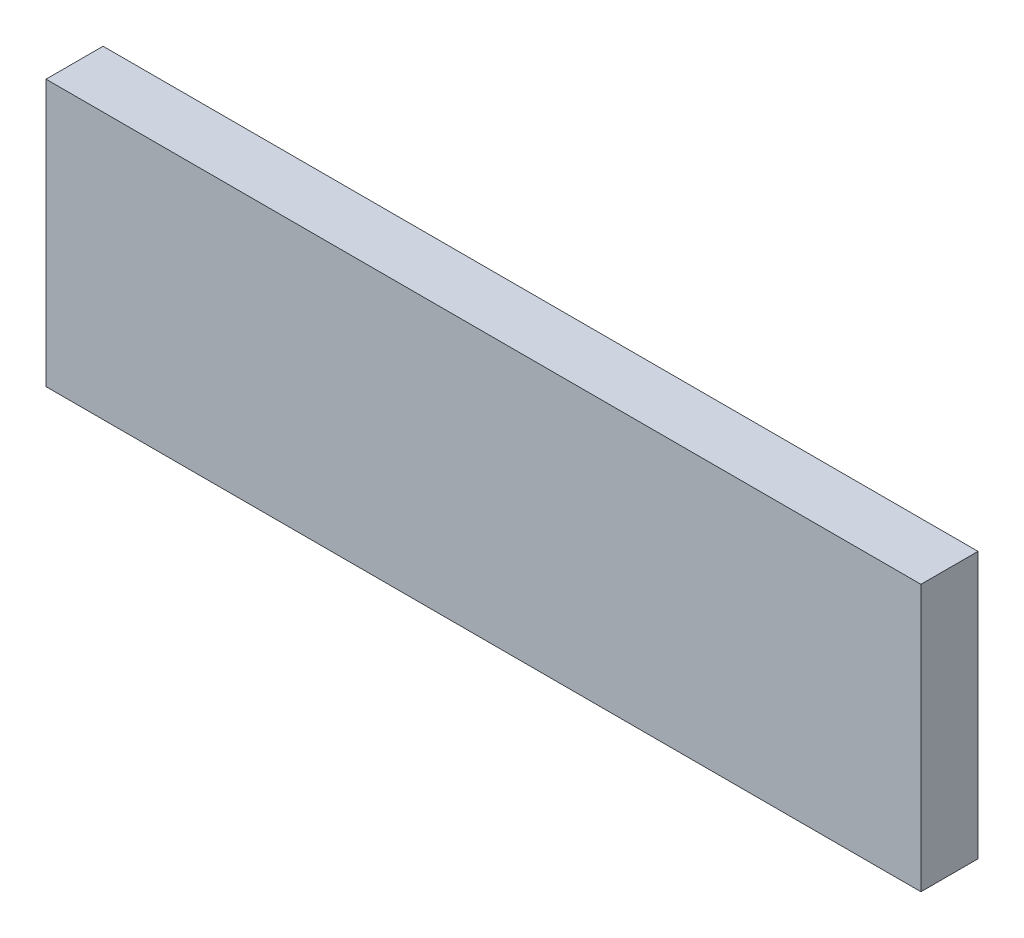
ISO-10303-21;
HEADER;
FILE_DESCRIPTION(('STEP AP214'),'2;1');
FILE_NAME('part.step','',(''),(''),'','','');
FILE_SCHEMA(('AUTOMOTIVE_DESIGN { 1 0 10303 214 1 1 1 1 }'));
ENDSEC;
DATA;
#1=APPLICATION_CONTEXT('core data for automotive mechanical design processes');
#2=APPLICATION_PROTOCOL_DEFINITION('international standard','automotive_design',2000,#1);
#3=PRODUCT_CONTEXT('',#1,'mechanical');
#4=PRODUCT('Part','Part','',(#3));
#5=PRODUCT_RELATED_PRODUCT_CATEGORY('part','',(#4));
#6=PRODUCT_DEFINITION_FORMATION('','',#4);
#7=PRODUCT_DEFINITION_CONTEXT('part definition',#1,'design');
#8=PRODUCT_DEFINITION('design','',#6,#7);
#9=PRODUCT_DEFINITION_SHAPE('','',#8);
#10=(LENGTH_UNIT() NAMED_UNIT(*) SI_UNIT(.MILLI.,.METRE.));
#11=(NAMED_UNIT(*) PLANE_ANGLE_UNIT() SI_UNIT($,.RADIAN.));
#12=(NAMED_UNIT(*) SI_UNIT($,.STERADIAN.) SOLID_ANGLE_UNIT());
#13=UNCERTAINTY_MEASURE_WITH_UNIT(LENGTH_MEASURE(1.E-05),#10,'distance_accuracy_value','');
#14=(GEOMETRIC_REPRESENTATION_CONTEXT(3) GLOBAL_UNCERTAINTY_ASSIGNED_CONTEXT((#13)) GLOBAL_UNIT_ASSIGNED_CONTEXT((#10,
#11,#12)) REPRESENTATION_CONTEXT('',''));
#15=CARTESIAN_POINT('',(0.,0.,0.));
#16=DIRECTION('',(0.,0.,1.));
#17=DIRECTION('',(1.,0.,0.));
#18=AXIS2_PLACEMENT_3D('',#15,#16,#17);
#19=CARTESIAN_POINT('',(0.,0.,3.));
#20=DIRECTION('',(1.,0.,0.));
#21=DIRECTION('',(0.,0.,-1.));
#22=AXIS2_PLACEMENT_3D('',#19,#20,#21);
#23=PLANE('',#22);
#24=DIRECTION('',(0.,-1.,0.));
#25=VECTOR('',#24,1.);
#26=CARTESIAN_POINT('',(0.,0.,0.));
#27=LINE('',#26,#25);
#28=CARTESIAN_POINT('',(0.,14.,0.));
#29=VERTEX_POINT('',#28);
#30=CARTESIAN_POINT('',(0.,0.,0.));
#31=VERTEX_POINT('',#30);
#32=EDGE_CURVE('E96',#29,#31,#27,.T.);
#33=ORIENTED_EDGE('',*,*,#32,.T.);
#34=DIRECTION('',(0.,0.,-1.));
#35=VECTOR('',#34,1.);
#36=CARTESIAN_POINT('',(0.,0.,3.));
#37=LINE('',#36,#35);
#38=CARTESIAN_POINT('',(0.,0.,3.));
#39=VERTEX_POINT('',#38);
#40=EDGE_CURVE('E11',#39,#31,#37,.T.);
#41=ORIENTED_EDGE('',*,*,#40,.F.);
#42=DIRECTION('',(0.,-1.,0.));
#43=VECTOR('',#42,1.);
#44=CARTESIAN_POINT('',(0.,0.,3.));
#45=LINE('',#44,#43);
#46=CARTESIAN_POINT('',(0.,14.,3.));
#47=VERTEX_POINT('',#46);
#48=EDGE_CURVE('E84',#47,#39,#45,.T.);
#49=ORIENTED_EDGE('',*,*,#48,.F.);
#50=DIRECTION('',(0.,0.,-1.));
#51=VECTOR('',#50,1.);
#52=CARTESIAN_POINT('',(0.,14.,3.));
#53=LINE('',#52,#51);
#54=EDGE_CURVE('E92',#47,#29,#53,.T.);
#55=ORIENTED_EDGE('',*,*,#54,.T.);
#56=EDGE_LOOP('',(#33,#41,#49,#55));
#57=FACE_BOUND('',#56,.T.);
#58=ADVANCED_FACE('F33',(#57),#23,.F.);
#59=CARTESIAN_POINT('',(0.,0.,3.));
#60=DIRECTION('',(0.,1.,0.));
#61=DIRECTION('',(0.,0.,1.));
#62=AXIS2_PLACEMENT_3D('',#59,#60,#61);
#63=PLANE('',#62);
#64=DIRECTION('',(1.,0.,0.));
#65=VECTOR('',#64,1.);
#66=CARTESIAN_POINT('',(0.,0.,0.));
#67=LINE('',#66,#65);
#68=CARTESIAN_POINT('',(46.,0.,0.));
#69=VERTEX_POINT('',#68);
#70=EDGE_CURVE('E88',#31,#69,#67,.T.);
#71=ORIENTED_EDGE('',*,*,#70,.T.);
#72=DIRECTION('',(0.,0.,-1.));
#73=VECTOR('',#72,1.);
#74=CARTESIAN_POINT('',(46.,0.,3.));
#75=LINE('',#74,#73);
#76=CARTESIAN_POINT('',(46.,0.,3.));
#77=VERTEX_POINT('',#76);
#78=EDGE_CURVE('E41',#77,#69,#75,.T.);
#79=ORIENTED_EDGE('',*,*,#78,.F.);
#80=DIRECTION('',(1.,0.,0.));
#81=VECTOR('',#80,1.);
#82=CARTESIAN_POINT('',(0.,0.,3.));
#83=LINE('',#82,#81);
#84=EDGE_CURVE('E79',#39,#77,#83,.T.);
#85=ORIENTED_EDGE('',*,*,#84,.F.);
#86=ORIENTED_EDGE('',*,*,#40,.T.);
#87=EDGE_LOOP('',(#71,#79,#85,#86));
#88=FACE_BOUND('',#87,.T.);
#89=ADVANCED_FACE('F87',(#88),#63,.F.);
#90=CARTESIAN_POINT('',(46.,0.,3.));
#91=DIRECTION('',(-1.,0.,0.));
#92=DIRECTION('',(0.,0.,1.));
#93=AXIS2_PLACEMENT_3D('',#90,#91,#92);
#94=PLANE('',#93);
#95=DIRECTION('',(0.,1.,0.));
#96=VECTOR('',#95,1.);
#97=CARTESIAN_POINT('',(46.,0.,0.));
#98=LINE('',#97,#96);
#99=CARTESIAN_POINT('',(46.,14.,0.));
#100=VERTEX_POINT('',#99);
#101=EDGE_CURVE('E66',#69,#100,#98,.T.);
#102=ORIENTED_EDGE('',*,*,#101,.T.);
#103=DIRECTION('',(0.,0.,-1.));
#104=VECTOR('',#103,1.);
#105=CARTESIAN_POINT('',(46.,14.,3.));
#106=LINE('',#105,#104);
#107=CARTESIAN_POINT('',(46.,14.,3.));
#108=VERTEX_POINT('',#107);
#109=EDGE_CURVE('E89',#108,#100,#106,.T.);
#110=ORIENTED_EDGE('',*,*,#109,.F.);
#111=DIRECTION('',(0.,1.,0.));
#112=VECTOR('',#111,1.);
#113=CARTESIAN_POINT('',(46.,0.,3.));
#114=LINE('',#113,#112);
#115=EDGE_CURVE('E82',#77,#108,#114,.T.);
#116=ORIENTED_EDGE('',*,*,#115,.F.);
#117=ORIENTED_EDGE('',*,*,#78,.T.);
#118=EDGE_LOOP('',(#102,#110,#116,#117));
#119=FACE_BOUND('',#118,.T.);
#120=ADVANCED_FACE('F90',(#119),#94,.F.);
#121=CARTESIAN_POINT('',(0.,14.,3.));
#122=DIRECTION('',(0.,-1.,0.));
#123=DIRECTION('',(0.,0.,-1.));
#124=AXIS2_PLACEMENT_3D('',#121,#122,#123);
#125=PLANE('',#124);
#126=DIRECTION('',(-1.,0.,0.));
#127=VECTOR('',#126,1.);
#128=CARTESIAN_POINT('',(0.,14.,0.));
#129=LINE('',#128,#127);
#130=EDGE_CURVE('E72',#100,#29,#129,.T.);
#131=ORIENTED_EDGE('',*,*,#130,.T.);
#132=ORIENTED_EDGE('',*,*,#54,.F.);
#133=DIRECTION('',(-1.,0.,0.));
#134=VECTOR('',#133,1.);
#135=CARTESIAN_POINT('',(0.,14.,3.));
#136=LINE('',#135,#134);
#137=EDGE_CURVE('E49',#108,#47,#136,.T.);
#138=ORIENTED_EDGE('',*,*,#137,.F.);
#139=ORIENTED_EDGE('',*,*,#109,.T.);
#140=EDGE_LOOP('',(#131,#132,#138,#139));
#141=FACE_BOUND('',#140,.T.);
#142=ADVANCED_FACE('F103',(#141),#125,.F.);
#143=CARTESIAN_POINT('',(0.,0.,3.));
#144=DIRECTION('',(0.,0.,-1.));
#145=DIRECTION('',(-1.,0.,0.));
#146=AXIS2_PLACEMENT_3D('',#143,#144,#145);
#147=PLANE('',#146);
#148=ORIENTED_EDGE('',*,*,#48,.T.);
#149=ORIENTED_EDGE('',*,*,#84,.T.);
#150=ORIENTED_EDGE('',*,*,#115,.T.);
#151=ORIENTED_EDGE('',*,*,#137,.T.);
#152=EDGE_LOOP('',(#148,#149,#150,#151));
#153=FACE_BOUND('',#152,.T.);
#154=ADVANCED_FACE('F80',(#153),#147,.F.);
#155=CARTESIAN_POINT('',(0.,0.,0.));
#156=DIRECTION('',(0.,0.,-1.));
#157=DIRECTION('',(-1.,0.,0.));
#158=AXIS2_PLACEMENT_3D('',#155,#156,#157);
#159=PLANE('',#158);
#160=ORIENTED_EDGE('',*,*,#32,.F.);
#161=ORIENTED_EDGE('',*,*,#130,.F.);
#162=ORIENTED_EDGE('',*,*,#101,.F.);
#163=ORIENTED_EDGE('',*,*,#70,.F.);
#164=EDGE_LOOP('',(#160,#161,#162,#163));
#165=FACE_BOUND('',#164,.T.);
#166=ADVANCED_FACE('F106',(#165),#159,.T.);
#167=CLOSED_SHELL('',(#58,#89,#120,#142,#154,#166));
#168=MANIFOLD_SOLID_BREP('B2',#167);
#169=ADVANCED_BREP_SHAPE_REPRESENTATION('',(#18,#168),#14);
#170=SHAPE_DEFINITION_REPRESENTATION(#9,#169);
ENDSEC;
END-ISO-10303-21;
